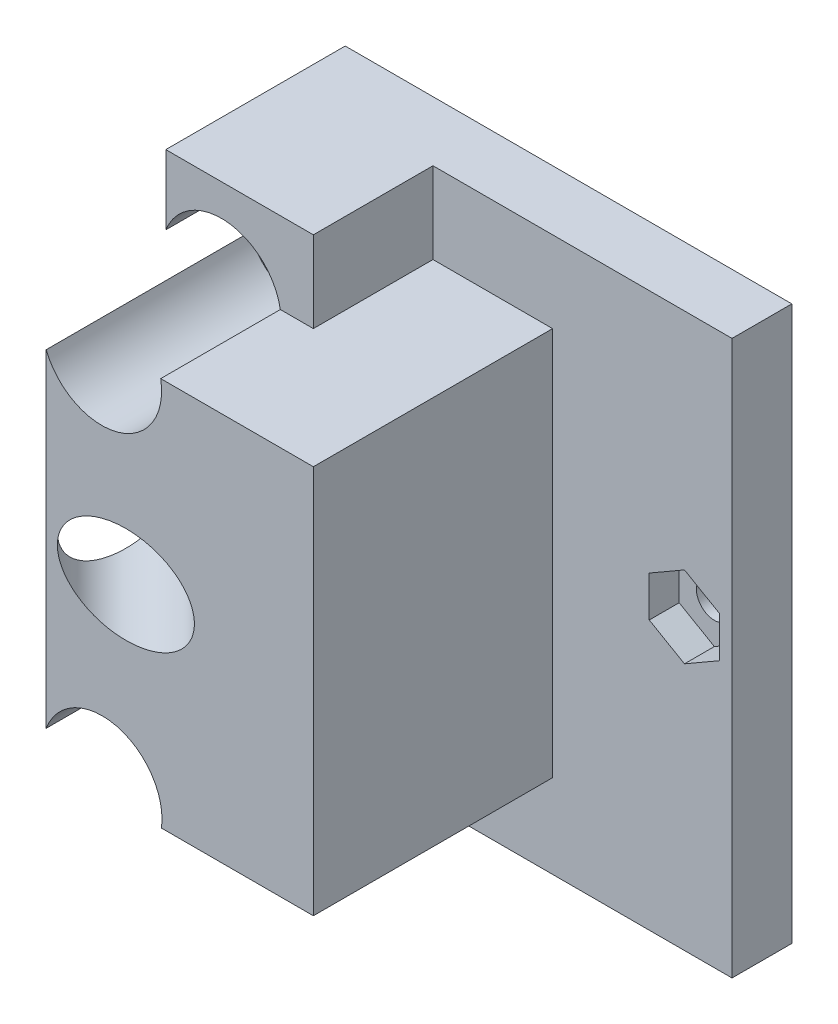
ISO-10303-21;
HEADER;
FILE_DESCRIPTION(('STEP AP214'),'2;1');
FILE_NAME('part.step','',(''),(''),'','','');
FILE_SCHEMA(('AUTOMOTIVE_DESIGN { 1 0 10303 214 1 1 1 1 }'));
ENDSEC;
DATA;
#1=APPLICATION_CONTEXT('core data for automotive mechanical design processes');
#2=APPLICATION_PROTOCOL_DEFINITION('international standard','automotive_design',2000,#1);
#3=PRODUCT_CONTEXT('',#1,'mechanical');
#4=PRODUCT('Part','Part','',(#3));
#5=PRODUCT_RELATED_PRODUCT_CATEGORY('part','',(#4));
#6=PRODUCT_DEFINITION_FORMATION('','',#4);
#7=PRODUCT_DEFINITION_CONTEXT('part definition',#1,'design');
#8=PRODUCT_DEFINITION('design','',#6,#7);
#9=PRODUCT_DEFINITION_SHAPE('','',#8);
#10=(LENGTH_UNIT() NAMED_UNIT(*) SI_UNIT(.MILLI.,.METRE.));
#11=(NAMED_UNIT(*) PLANE_ANGLE_UNIT() SI_UNIT($,.RADIAN.));
#12=(NAMED_UNIT(*) SI_UNIT($,.STERADIAN.) SOLID_ANGLE_UNIT());
#13=UNCERTAINTY_MEASURE_WITH_UNIT(LENGTH_MEASURE(1.E-05),#10,'distance_accuracy_value','');
#14=(GEOMETRIC_REPRESENTATION_CONTEXT(3) GLOBAL_UNCERTAINTY_ASSIGNED_CONTEXT((#13)) GLOBAL_UNIT_ASSIGNED_CONTEXT((#10,
#11,#12)) REPRESENTATION_CONTEXT('',''));
#15=CARTESIAN_POINT('',(0.,0.,0.));
#16=DIRECTION('',(0.,0.,1.));
#17=DIRECTION('',(1.,0.,0.));
#18=AXIS2_PLACEMENT_3D('',#15,#16,#17);
#19=CARTESIAN_POINT('',(30.675,21.15,15.));
#20=DIRECTION('',(-1.,0.,0.));
#21=DIRECTION('',(0.,-1.,0.));
#22=AXIS2_PLACEMENT_3D('',#19,#20,#21);
#23=PLANE('',#22);
#24=DIRECTION('',(0.,0.,-1.));
#25=VECTOR('',#24,1.);
#26=CARTESIAN_POINT('',(30.675,-16.155842551155,25.));
#27=LINE('',#26,#25);
#28=CARTESIAN_POINT('',(30.675,-16.155842551155,15.));
#29=VERTEX_POINT('',#28);
#30=CARTESIAN_POINT('',(30.675,-16.155842551155,5.));
#31=VERTEX_POINT('',#30);
#32=EDGE_CURVE('E226',#29,#31,#27,.T.);
#33=ORIENTED_EDGE('',*,*,#32,.F.);
#34=DIRECTION('',(0.,1.,0.));
#35=VECTOR('',#34,1.);
#36=CARTESIAN_POINT('',(30.675,21.15,15.));
#37=LINE('',#36,#35);
#38=CARTESIAN_POINT('',(30.67125,-21.15,15.));
#39=VERTEX_POINT('',#38);
#40=EDGE_CURVE('E423',#39,#29,#37,.T.);
#41=ORIENTED_EDGE('',*,*,#40,.F.);
#42=CARTESIAN_POINT('',(30.675,-21.15,15.));
#43=DIRECTION('',(0.,0.,-1.));
#44=VECTOR('',#43,1.);
#45=LINE('',#42,#44);
#46=CARTESIAN_POINT('',(30.67125,-21.15,5.));
#47=VERTEX_POINT('',#46);
#48=EDGE_CURVE('E431',#39,#47,#45,.T.);
#49=ORIENTED_EDGE('',*,*,#48,.T.);
#50=DIRECTION('',(0.,-1.,0.));
#51=VECTOR('',#50,1.);
#52=CARTESIAN_POINT('',(30.675,23.15,5.));
#53=LINE('',#52,#51);
#54=EDGE_CURVE('E39',#31,#47,#53,.T.);
#55=ORIENTED_EDGE('',*,*,#54,.F.);
#56=EDGE_LOOP('',(#33,#41,#49,#55));
#57=FACE_BOUND('',#56,.T.);
#58=ADVANCED_FACE('F35',(#57),#23,.F.);
#59=DIRECTION('',(0.,0.,1.));
#60=VECTOR('',#59,1.);
#61=CARTESIAN_POINT('',(30.675,16.3577374600954,25.));
#62=LINE('',#61,#60);
#63=CARTESIAN_POINT('',(30.675,16.3577374600954,5.));
#64=VERTEX_POINT('',#63);
#65=CARTESIAN_POINT('',(30.675,16.3577374600954,15.));
#66=VERTEX_POINT('',#65);
#67=EDGE_CURVE('E224',#64,#66,#62,.T.);
#68=ORIENTED_EDGE('',*,*,#67,.F.);
#69=CARTESIAN_POINT('',(30.675,23.15,5.));
#70=VERTEX_POINT('',#69);
#71=EDGE_CURVE('E308',#70,#64,#53,.T.);
#72=ORIENTED_EDGE('',*,*,#71,.F.);
#73=DIRECTION('',(0.,0.,-1.));
#74=VECTOR('',#73,1.);
#75=CARTESIAN_POINT('',(30.675,23.15,15.));
#76=LINE('',#75,#74);
#77=CARTESIAN_POINT('',(30.675,23.15,15.));
#78=VERTEX_POINT('',#77);
#79=EDGE_CURVE('E463',#78,#70,#76,.T.);
#80=ORIENTED_EDGE('',*,*,#79,.F.);
#81=EDGE_CURVE('E436',#66,#78,#37,.T.);
#82=ORIENTED_EDGE('',*,*,#81,.F.);
#83=EDGE_LOOP('',(#68,#72,#80,#82));
#84=FACE_BOUND('',#83,.T.);
#85=ADVANCED_FACE('F345',(#84),#23,.F.);
#86=CARTESIAN_POINT('',(55.675,23.15,5.));
#87=DIRECTION('',(0.,0.,-1.));
#88=DIRECTION('',(0.,1.,0.));
#89=AXIS2_PLACEMENT_3D('',#86,#87,#88);
#90=PLANE('',#89);
#91=DIRECTION('',(0.866025403784439,0.499999999999999,0.));
#92=VECTOR('',#91,1.);
#93=CARTESIAN_POINT('',(51.7,-2.40000000000001,5.));
#94=LINE('',#93,#92);
#95=CARTESIAN_POINT('',(51.7,-2.40000000000002,5.));
#96=VERTEX_POINT('',#95);
#97=CARTESIAN_POINT('',(54.6444863728671,-0.70000000000001,5.));
#98=VERTEX_POINT('',#97);
#99=EDGE_CURVE('E256',#96,#98,#94,.T.);
#100=ORIENTED_EDGE('',*,*,#99,.F.);
#101=DIRECTION('',(0.866025403784438,-0.500000000000001,0.));
#102=VECTOR('',#101,1.);
#103=CARTESIAN_POINT('',(48.7555136271329,-0.700000000000011,5.));
#104=LINE('',#103,#102);
#105=CARTESIAN_POINT('',(48.7555136271329,-0.700000000000011,5.));
#106=VERTEX_POINT('',#105);
#107=EDGE_CURVE('E61',#106,#96,#104,.T.);
#108=ORIENTED_EDGE('',*,*,#107,.F.);
#109=DIRECTION('',(0.,-1.,0.));
#110=VECTOR('',#109,1.);
#111=CARTESIAN_POINT('',(48.7555136271329,2.7,5.));
#112=LINE('',#111,#110);
#113=CARTESIAN_POINT('',(48.7555136271329,2.7,5.));
#114=VERTEX_POINT('',#113);
#115=EDGE_CURVE('E239',#114,#106,#112,.T.);
#116=ORIENTED_EDGE('',*,*,#115,.F.);
#117=DIRECTION('',(-0.866025403784439,-0.5,0.));
#118=VECTOR('',#117,1.);
#119=CARTESIAN_POINT('',(51.7,4.39999999999999,5.));
#120=LINE('',#119,#118);
#121=CARTESIAN_POINT('',(51.7,4.39999999999999,5.));
#122=VERTEX_POINT('',#121);
#123=EDGE_CURVE('E265',#122,#114,#120,.T.);
#124=ORIENTED_EDGE('',*,*,#123,.F.);
#125=DIRECTION('',(-0.866025403784439,0.5,0.));
#126=VECTOR('',#125,1.);
#127=CARTESIAN_POINT('',(54.6444863728671,2.69999999999999,5.));
#128=LINE('',#127,#126);
#129=CARTESIAN_POINT('',(54.6444863728671,2.69999999999999,5.));
#130=VERTEX_POINT('',#129);
#131=EDGE_CURVE('E262',#130,#122,#128,.T.);
#132=ORIENTED_EDGE('',*,*,#131,.F.);
#133=DIRECTION('',(0.,1.,0.));
#134=VECTOR('',#133,1.);
#135=CARTESIAN_POINT('',(54.6444863728671,-0.70000000000001,5.));
#136=LINE('',#135,#134);
#137=EDGE_CURVE('E259',#98,#130,#136,.T.);
#138=ORIENTED_EDGE('',*,*,#137,.F.);
#139=EDGE_LOOP('',(#100,#108,#116,#124,#132,#138));
#140=FACE_BOUND('',#139,.T.);
#141=DIRECTION('',(-1.,0.,0.));
#142=VECTOR('',#141,1.);
#143=CARTESIAN_POINT('',(40.675,-16.155842551155,5.));
#144=LINE('',#143,#142);
#145=CARTESIAN_POINT('',(40.675,-16.155842551155,4.99999999999999));
#146=VERTEX_POINT('',#145);
#147=EDGE_CURVE('E53',#146,#31,#144,.T.);
#148=ORIENTED_EDGE('',*,*,#147,.T.);
#149=ORIENTED_EDGE('',*,*,#54,.T.);
#150=CARTESIAN_POINT('',(30.675,-23.1592483433118,4.99999999999999));
#151=VERTEX_POINT('',#150);
#152=EDGE_CURVE('E304',#47,#151,#53,.T.);
#153=ORIENTED_EDGE('',*,*,#152,.T.);
#154=DIRECTION('',(-1.,0.,0.));
#155=VECTOR('',#154,1.);
#156=CARTESIAN_POINT('',(55.675,-23.1592483433118,4.99999999999999));
#157=LINE('',#156,#155);
#158=CARTESIAN_POINT('',(55.675,-23.1592483433118,4.99999999999999));
#159=VERTEX_POINT('',#158);
#160=EDGE_CURVE('E529',#159,#151,#157,.T.);
#161=ORIENTED_EDGE('',*,*,#160,.F.);
#162=DIRECTION('',(0.,-1.,0.));
#163=VECTOR('',#162,1.);
#164=CARTESIAN_POINT('',(55.675,23.15,5.));
#165=LINE('',#164,#163);
#166=CARTESIAN_POINT('',(55.675,23.15,5.));
#167=VERTEX_POINT('',#166);
#168=EDGE_CURVE('E292',#167,#159,#165,.T.);
#169=ORIENTED_EDGE('',*,*,#168,.F.);
#170=DIRECTION('',(-1.,0.,0.));
#171=VECTOR('',#170,1.);
#172=CARTESIAN_POINT('',(55.675,23.15,5.));
#173=LINE('',#172,#171);
#174=EDGE_CURVE('E305',#167,#70,#173,.T.);
#175=ORIENTED_EDGE('',*,*,#174,.T.);
#176=ORIENTED_EDGE('',*,*,#71,.T.);
#177=DIRECTION('',(-1.,0.,0.));
#178=VECTOR('',#177,1.);
#179=CARTESIAN_POINT('',(40.675,16.3577374600954,5.));
#180=LINE('',#179,#178);
#181=CARTESIAN_POINT('',(40.675,16.3577374600954,5.));
#182=VERTEX_POINT('',#181);
#183=EDGE_CURVE('E231',#182,#64,#180,.T.);
#184=ORIENTED_EDGE('',*,*,#183,.F.);
#185=DIRECTION('',(0.,1.,0.));
#186=VECTOR('',#185,1.);
#187=CARTESIAN_POINT('',(40.675,16.3577374600954,5.));
#188=LINE('',#187,#186);
#189=EDGE_CURVE('E218',#146,#182,#188,.T.);
#190=ORIENTED_EDGE('',*,*,#189,.F.);
#191=EDGE_LOOP('',(#148,#149,#153,#161,#169,#175,#176,#184,#190));
#192=FACE_BOUND('',#191,.T.);
#193=ADVANCED_FACE('F341',(#140,#192),#90,.F.);
#194=CARTESIAN_POINT('',(51.7,0.999999999999993,-20.));
#195=DIRECTION('',(0.,0.,1.));
#196=DIRECTION('',(1.,0.,0.));
#197=AXIS2_PLACEMENT_3D('',#194,#195,#196);
#198=CYLINDRICAL_SURFACE('',#197,1.5);
#199=CARTESIAN_POINT('',(51.7,0.999999999999993,0.));
#200=DIRECTION('',(0.,0.,1.));
#201=DIRECTION('',(1.,0.,0.));
#202=AXIS2_PLACEMENT_3D('',#199,#200,#201);
#203=CIRCLE('',#202,1.5);
#204=CARTESIAN_POINT('',(53.2,0.999999999999993,0.));
#205=VERTEX_POINT('',#204);
#206=EDGE_CURVE('E282',#205,#205,#203,.T.);
#207=ORIENTED_EDGE('',*,*,#206,.F.);
#208=EDGE_LOOP('',(#207));
#209=FACE_BOUND('',#208,.T.);
#210=CARTESIAN_POINT('',(51.7,0.999999999999993,2.5));
#211=DIRECTION('',(0.,0.,1.));
#212=DIRECTION('',(1.,0.,0.));
#213=AXIS2_PLACEMENT_3D('',#210,#211,#212);
#214=CIRCLE('',#213,1.5);
#215=CARTESIAN_POINT('',(53.2,0.999999999999993,2.5));
#216=VERTEX_POINT('',#215);
#217=EDGE_CURVE('E272',#216,#216,#214,.F.);
#218=ORIENTED_EDGE('',*,*,#217,.F.);
#219=EDGE_LOOP('',(#218));
#220=FACE_BOUND('',#219,.T.);
#221=ADVANCED_FACE('F344',(#209,#220),#198,.F.);
#222=CARTESIAN_POINT('',(23.0217282457291,-15.5,50.));
#223=DIRECTION('',(0.,0.,-1.));
#224=DIRECTION('',(-1.,0.,0.));
#225=AXIS2_PLACEMENT_3D('',#222,#223,#224);
#226=CYLINDRICAL_SURFACE('',#225,1.6);
#227=CARTESIAN_POINT('',(23.0217282457291,-15.5,0.));
#228=DIRECTION('',(0.,0.,-1.));
#229=DIRECTION('',(-1.,0.,0.));
#230=AXIS2_PLACEMENT_3D('',#227,#228,#229);
#231=CIRCLE('',#230,1.6);
#232=CARTESIAN_POINT('',(21.4217282457291,-15.5,0.));
#233=VERTEX_POINT('',#232);
#234=EDGE_CURVE('E481',#233,#233,#231,.T.);
#235=ORIENTED_EDGE('',*,*,#234,.T.);
#236=EDGE_LOOP('',(#235));
#237=FACE_BOUND('',#236,.T.);
#238=CARTESIAN_POINT('',(23.0217282457291,-15.5,7.99999999999999));
#239=DIRECTION('',(0.,0.,1.));
#240=DIRECTION('',(1.,0.,0.));
#241=AXIS2_PLACEMENT_3D('',#238,#239,#240);
#242=CIRCLE('',#241,1.6);
#243=CARTESIAN_POINT('',(24.6217282457291,-15.5,7.99999999999999));
#244=VERTEX_POINT('',#243);
#245=EDGE_CURVE('E492',#244,#244,#242,.F.);
#246=ORIENTED_EDGE('',*,*,#245,.F.);
#247=EDGE_LOOP('',(#246));
#248=FACE_BOUND('',#247,.T.);
#249=ADVANCED_FACE('F370',(#237,#248),#226,.F.);
#250=CARTESIAN_POINT('',(22.9875,15.5,50.));
#251=DIRECTION('',(0.,0.,-1.));
#252=DIRECTION('',(-1.,0.,0.));
#253=AXIS2_PLACEMENT_3D('',#250,#251,#252);
#254=CYLINDRICAL_SURFACE('',#253,1.6);
#255=CARTESIAN_POINT('',(22.9875,15.5,0.));
#256=DIRECTION('',(0.,0.,-1.));
#257=DIRECTION('',(-1.,0.,0.));
#258=AXIS2_PLACEMENT_3D('',#255,#256,#257);
#259=CIRCLE('',#258,1.6);
#260=CARTESIAN_POINT('',(21.3875,15.5,0.));
#261=VERTEX_POINT('',#260);
#262=EDGE_CURVE('E479',#261,#261,#259,.T.);
#263=ORIENTED_EDGE('',*,*,#262,.T.);
#264=EDGE_LOOP('',(#263));
#265=FACE_BOUND('',#264,.T.);
#266=CARTESIAN_POINT('',(22.9875,15.5,7.99999999999999));
#267=DIRECTION('',(0.,0.,1.));
#268=DIRECTION('',(1.,0.,0.));
#269=AXIS2_PLACEMENT_3D('',#266,#267,#268);
#270=CIRCLE('',#269,1.6);
#271=CARTESIAN_POINT('',(24.5875,15.5,7.99999999999999));
#272=VERTEX_POINT('',#271);
#273=EDGE_CURVE('E444',#272,#272,#270,.F.);
#274=ORIENTED_EDGE('',*,*,#273,.F.);
#275=EDGE_LOOP('',(#274));
#276=FACE_BOUND('',#275,.T.);
#277=ADVANCED_FACE('F367',(#265,#276),#254,.F.);
#278=CARTESIAN_POINT('',(30.7,-16.155842551155,15.));
#279=DIRECTION('',(0.,1.,0.));
#280=DIRECTION('',(0.,0.,1.));
#281=AXIS2_PLACEMENT_3D('',#278,#279,#280);
#282=PLANE('',#281);
#283=DIRECTION('',(-1.,0.,0.));
#284=VECTOR('',#283,1.);
#285=CARTESIAN_POINT('',(30.7,-16.155842551155,25.));
#286=LINE('',#285,#284);
#287=CARTESIAN_POINT('',(40.675,-16.155842551155,25.));
#288=VERTEX_POINT('',#287);
#289=CARTESIAN_POINT('',(27.9785286802932,-16.155842551155,25.));
#290=VERTEX_POINT('',#289);
#291=EDGE_CURVE('E202',#288,#290,#286,.T.);
#292=ORIENTED_EDGE('',*,*,#291,.T.);
#293=DIRECTION('',(0.,0.,1.));
#294=VECTOR('',#293,1.);
#295=CARTESIAN_POINT('',(27.9785286802932,-16.155842551155,7.99999999999999));
#296=LINE('',#295,#294);
#297=CARTESIAN_POINT('',(27.9785286802932,-16.155842551155,15.));
#298=VERTEX_POINT('',#297);
#299=EDGE_CURVE('E427',#290,#298,#296,.F.);
#300=ORIENTED_EDGE('',*,*,#299,.T.);
#301=DIRECTION('',(-1.,0.,0.));
#302=VECTOR('',#301,1.);
#303=CARTESIAN_POINT('',(30.7,-16.155842551155,15.));
#304=LINE('',#303,#302);
#305=EDGE_CURVE('E426',#29,#298,#304,.T.);
#306=ORIENTED_EDGE('',*,*,#305,.F.);
#307=ORIENTED_EDGE('',*,*,#32,.T.);
#308=ORIENTED_EDGE('',*,*,#147,.F.);
#309=DIRECTION('',(0.,0.,-1.));
#310=VECTOR('',#309,1.);
#311=CARTESIAN_POINT('',(40.675,-16.155842551155,25.));
#312=LINE('',#311,#310);
#313=EDGE_CURVE('E214',#288,#146,#312,.T.);
#314=ORIENTED_EDGE('',*,*,#313,.F.);
#315=EDGE_LOOP('',(#292,#300,#306,#307,#308,#314));
#316=FACE_BOUND('',#315,.T.);
#317=ADVANCED_FACE('F215',(#316),#282,.F.);
#318=CARTESIAN_POINT('',(30.7,16.3577374600954,25.));
#319=DIRECTION('',(0.,0.,-1.));
#320=DIRECTION('',(-1.,0.,0.));
#321=AXIS2_PLACEMENT_3D('',#318,#319,#320);
#322=PLANE('',#321);
#323=CARTESIAN_POINT('',(25.0000000000006,0.,25.));
#324=DIRECTION('',(0.,0.,-1.));
#325=DIRECTION('',(1.,0.,0.));
#326=AXIS2_PLACEMENT_3D('',#323,#324,#325);
#327=ELLIPSE('',#326,5.72756492761111,4.05);
#328=CARTESIAN_POINT('',(30.7275649276117,0.,25.));
#329=VERTEX_POINT('',#328);
#330=EDGE_CURVE('E450',#329,#329,#327,.T.);
#331=ORIENTED_EDGE('',*,*,#330,.T.);
#332=EDGE_LOOP('',(#331));
#333=FACE_BOUND('',#332,.T.);
#334=DIRECTION('',(-1.,0.,0.));
#335=VECTOR('',#334,1.);
#336=CARTESIAN_POINT('',(30.7,16.3577374600954,25.));
#337=LINE('',#336,#335);
#338=CARTESIAN_POINT('',(40.675,16.3577374600954,25.));
#339=VERTEX_POINT('',#338);
#340=CARTESIAN_POINT('',(27.9133792564931,16.3577374600954,25.));
#341=VERTEX_POINT('',#340);
#342=EDGE_CURVE('E211',#339,#341,#337,.T.);
#343=ORIENTED_EDGE('',*,*,#342,.T.);
#344=CARTESIAN_POINT('',(22.9875,15.5,25.));
#345=DIRECTION('',(0.,0.,1.));
#346=DIRECTION('',(1.,0.,0.));
#347=AXIS2_PLACEMENT_3D('',#344,#345,#346);
#348=CIRCLE('',#347,5.);
#349=CARTESIAN_POINT('',(18.3375,13.6622024050511,25.));
#350=VERTEX_POINT('',#349);
#351=EDGE_CURVE('E493',#350,#341,#348,.T.);
#352=ORIENTED_EDGE('',*,*,#351,.F.);
#353=DIRECTION('',(0.,-1.,0.));
#354=VECTOR('',#353,1.);
#355=CARTESIAN_POINT('',(18.3375,23.15,25.));
#356=LINE('',#355,#354);
#357=CARTESIAN_POINT('',(18.3375,-13.7512845451837,25.));
#358=VERTEX_POINT('',#357);
#359=EDGE_CURVE('E321',#350,#358,#356,.T.);
#360=ORIENTED_EDGE('',*,*,#359,.T.);
#361=CARTESIAN_POINT('',(23.0217282457291,-15.5,25.));
#362=DIRECTION('',(0.,0.,1.));
#363=DIRECTION('',(1.,0.,0.));
#364=AXIS2_PLACEMENT_3D('',#361,#362,#363);
#365=CIRCLE('',#364,5.);
#366=EDGE_CURVE('E208',#290,#358,#365,.T.);
#367=ORIENTED_EDGE('',*,*,#366,.F.);
#368=ORIENTED_EDGE('',*,*,#291,.F.);
#369=DIRECTION('',(0.,-1.,0.));
#370=VECTOR('',#369,1.);
#371=CARTESIAN_POINT('',(40.675,16.3577374600954,25.));
#372=LINE('',#371,#370);
#373=EDGE_CURVE('E205',#339,#288,#372,.T.);
#374=ORIENTED_EDGE('',*,*,#373,.F.);
#375=EDGE_LOOP('',(#343,#352,#360,#367,#368,#374));
#376=FACE_BOUND('',#375,.T.);
#377=ADVANCED_FACE('F203',(#333,#376),#322,.F.);
#378=CARTESIAN_POINT('',(0.,0.,15.));
#379=DIRECTION('',(0.,0.,1.));
#380=DIRECTION('',(1.,0.,0.));
#381=AXIS2_PLACEMENT_3D('',#378,#379,#380);
#382=PLANE('',#381);
#383=DIRECTION('',(0.,1.,0.));
#384=VECTOR('',#383,1.);
#385=CARTESIAN_POINT('',(18.3375,0.,15.));
#386=LINE('',#385,#384);
#387=CARTESIAN_POINT('',(18.3375,-23.15,15.));
#388=VERTEX_POINT('',#387);
#389=CARTESIAN_POINT('',(18.3375,-17.2487154548163,15.));
#390=VERTEX_POINT('',#389);
#391=EDGE_CURVE('E516',#388,#390,#386,.T.);
#392=ORIENTED_EDGE('',*,*,#391,.F.);
#393=DIRECTION('',(1.,0.,0.));
#394=VECTOR('',#393,1.);
#395=CARTESIAN_POINT('',(15.3375,-23.15,15.));
#396=LINE('',#395,#394);
#397=CARTESIAN_POINT('',(30.6675,-23.15,15.));
#398=VERTEX_POINT('',#397);
#399=EDGE_CURVE('E455',#388,#398,#396,.T.);
#400=ORIENTED_EDGE('',*,*,#399,.T.);
#401=DIRECTION('',(0.,1.,0.));
#402=VECTOR('',#401,1.);
#403=CARTESIAN_POINT('',(30.6675,-21.15,15.));
#404=LINE('',#403,#402);
#405=EDGE_CURVE('E392',#398,#39,#404,.T.);
#406=ORIENTED_EDGE('',*,*,#405,.T.);
#407=ORIENTED_EDGE('',*,*,#40,.T.);
#408=ORIENTED_EDGE('',*,*,#305,.T.);
#409=CARTESIAN_POINT('',(23.0217282457291,-15.5,15.));
#410=DIRECTION('',(0.,0.,1.));
#411=DIRECTION('',(1.,0.,0.));
#412=AXIS2_PLACEMENT_3D('',#409,#410,#411);
#413=CIRCLE('',#412,5.);
#414=EDGE_CURVE('E490',#390,#298,#413,.T.);
#415=ORIENTED_EDGE('',*,*,#414,.F.);
#416=EDGE_LOOP('',(#392,#400,#406,#407,#408,#415));
#417=FACE_BOUND('',#416,.T.);
#418=ADVANCED_FACE('F434',(#417),#382,.T.);
#419=DIRECTION('',(0.,1.,0.));
#420=VECTOR('',#419,1.);
#421=CARTESIAN_POINT('',(18.3375,0.,15.));
#422=LINE('',#421,#420);
#423=CARTESIAN_POINT('',(18.3375,17.3377975949489,15.));
#424=VERTEX_POINT('',#423);
#425=CARTESIAN_POINT('',(18.3375,23.15,15.));
#426=VERTEX_POINT('',#425);
#427=EDGE_CURVE('E506',#424,#426,#422,.T.);
#428=ORIENTED_EDGE('',*,*,#427,.F.);
#429=CARTESIAN_POINT('',(22.9875,15.5,15.));
#430=DIRECTION('',(0.,0.,1.));
#431=DIRECTION('',(1.,0.,0.));
#432=AXIS2_PLACEMENT_3D('',#429,#430,#431);
#433=CIRCLE('',#432,5.);
#434=CARTESIAN_POINT('',(27.9133792564931,16.3577374600954,15.));
#435=VERTEX_POINT('',#434);
#436=EDGE_CURVE('E484',#435,#424,#433,.T.);
#437=ORIENTED_EDGE('',*,*,#436,.F.);
#438=DIRECTION('',(-1.,0.,0.));
#439=VECTOR('',#438,1.);
#440=CARTESIAN_POINT('',(30.7,16.3577374600954,15.));
#441=LINE('',#440,#439);
#442=EDGE_CURVE('E430',#66,#435,#441,.T.);
#443=ORIENTED_EDGE('',*,*,#442,.F.);
#444=ORIENTED_EDGE('',*,*,#81,.T.);
#445=DIRECTION('',(-1.,0.,0.));
#446=VECTOR('',#445,1.);
#447=CARTESIAN_POINT('',(30.675,23.15,15.));
#448=LINE('',#447,#446);
#449=EDGE_CURVE('E469',#78,#426,#448,.T.);
#450=ORIENTED_EDGE('',*,*,#449,.T.);
#451=EDGE_LOOP('',(#428,#437,#443,#444,#450));
#452=FACE_BOUND('',#451,.T.);
#453=ADVANCED_FACE('F569',(#452),#382,.T.);
#454=CARTESIAN_POINT('',(0.,0.,0.));
#455=DIRECTION('',(0.,0.,1.));
#456=DIRECTION('',(1.,0.,0.));
#457=AXIS2_PLACEMENT_3D('',#454,#455,#456);
#458=PLANE('',#457);
#459=ORIENTED_EDGE('',*,*,#206,.T.);
#460=EDGE_LOOP('',(#459));
#461=FACE_BOUND('',#460,.T.);
#462=ORIENTED_EDGE('',*,*,#262,.F.);
#463=EDGE_LOOP('',(#462));
#464=FACE_BOUND('',#463,.T.);
#465=ORIENTED_EDGE('',*,*,#234,.F.);
#466=EDGE_LOOP('',(#465));
#467=FACE_BOUND('',#466,.T.);
#468=DIRECTION('',(1.,0.,0.));
#469=VECTOR('',#468,1.);
#470=CARTESIAN_POINT('',(15.3375,-23.15,0.));
#471=LINE('',#470,#469);
#472=CARTESIAN_POINT('',(18.3375,-23.15,0.));
#473=VERTEX_POINT('',#472);
#474=CARTESIAN_POINT('',(30.6675,-23.15,0.));
#475=VERTEX_POINT('',#474);
#476=EDGE_CURVE('E459',#473,#475,#471,.T.);
#477=ORIENTED_EDGE('',*,*,#476,.F.);
#478=DIRECTION('',(0.,-1.,0.));
#479=VECTOR('',#478,1.);
#480=CARTESIAN_POINT('',(18.3375,23.15,0.));
#481=LINE('',#480,#479);
#482=CARTESIAN_POINT('',(18.3375,23.15,0.));
#483=VERTEX_POINT('',#482);
#484=EDGE_CURVE('E527',#483,#473,#481,.T.);
#485=ORIENTED_EDGE('',*,*,#484,.F.);
#486=DIRECTION('',(-1.,0.,0.));
#487=VECTOR('',#486,1.);
#488=CARTESIAN_POINT('',(30.675,23.15,0.));
#489=LINE('',#488,#487);
#490=CARTESIAN_POINT('',(55.675,23.15,0.));
#491=VERTEX_POINT('',#490);
#492=EDGE_CURVE('E474',#491,#483,#489,.T.);
#493=ORIENTED_EDGE('',*,*,#492,.F.);
#494=DIRECTION('',(0.,1.,0.));
#495=VECTOR('',#494,1.);
#496=CARTESIAN_POINT('',(55.675,23.15,0.));
#497=LINE('',#496,#495);
#498=CARTESIAN_POINT('',(55.675,-23.1592483433118,0.));
#499=VERTEX_POINT('',#498);
#500=EDGE_CURVE('E286',#499,#491,#497,.T.);
#501=ORIENTED_EDGE('',*,*,#500,.F.);
#502=DIRECTION('',(-1.,0.,0.));
#503=VECTOR('',#502,1.);
#504=CARTESIAN_POINT('',(55.675,-23.1592483433118,0.));
#505=LINE('',#504,#503);
#506=CARTESIAN_POINT('',(30.675,-23.1592483433118,0.));
#507=VERTEX_POINT('',#506);
#508=EDGE_CURVE('E296',#499,#507,#505,.T.);
#509=ORIENTED_EDGE('',*,*,#508,.T.);
#510=DIRECTION('',(0.,1.,0.));
#511=VECTOR('',#510,1.);
#512=CARTESIAN_POINT('',(30.675,23.15,0.));
#513=LINE('',#512,#511);
#514=CARTESIAN_POINT('',(30.673125,-21.15,0.));
#515=VERTEX_POINT('',#514);
#516=EDGE_CURVE('E285',#507,#515,#513,.T.);
#517=ORIENTED_EDGE('',*,*,#516,.T.);
#518=DIRECTION('',(0.,1.,0.));
#519=VECTOR('',#518,1.);
#520=CARTESIAN_POINT('',(30.6675,-21.15,0.));
#521=LINE('',#520,#519);
#522=EDGE_CURVE('E456',#475,#515,#521,.T.);
#523=ORIENTED_EDGE('',*,*,#522,.F.);
#524=EDGE_LOOP('',(#477,#485,#493,#501,#509,#517,#523));
#525=FACE_BOUND('',#524,.T.);
#526=ADVANCED_FACE('F542',(#461,#464,#467,#525),#458,.F.);
#527=CARTESIAN_POINT('',(30.7,16.3577374600954,15.));
#528=DIRECTION('',(0.,-1.,0.));
#529=DIRECTION('',(0.,0.,-1.));
#530=AXIS2_PLACEMENT_3D('',#527,#528,#529);
#531=PLANE('',#530);
#532=ORIENTED_EDGE('',*,*,#67,.T.);
#533=ORIENTED_EDGE('',*,*,#442,.T.);
#534=DIRECTION('',(0.,0.,1.));
#535=VECTOR('',#534,1.);
#536=CARTESIAN_POINT('',(27.9133792564931,16.3577374600954,7.99999999999999));
#537=LINE('',#536,#535);
#538=EDGE_CURVE('E45',#435,#341,#537,.T.);
#539=ORIENTED_EDGE('',*,*,#538,.T.);
#540=ORIENTED_EDGE('',*,*,#342,.F.);
#541=DIRECTION('',(0.,0.,1.));
#542=VECTOR('',#541,1.);
#543=CARTESIAN_POINT('',(40.675,16.3577374600954,25.));
#544=LINE('',#543,#542);
#545=EDGE_CURVE('E223',#182,#339,#544,.T.);
#546=ORIENTED_EDGE('',*,*,#545,.F.);
#547=ORIENTED_EDGE('',*,*,#183,.T.);
#548=EDGE_LOOP('',(#532,#533,#539,#540,#546,#547));
#549=FACE_BOUND('',#548,.T.);
#550=ADVANCED_FACE('F547',(#549),#531,.F.);
#551=CARTESIAN_POINT('',(15.7664321881348,0.,15.7664321881344));
#552=DIRECTION('',(0.707106781186556,0.,0.707106781186539));
#553=DIRECTION('',(0.707106781186539,0.,-0.707106781186556));
#554=AXIS2_PLACEMENT_3D('',#551,#552,#553);
#555=CYLINDRICAL_SURFACE('',#554,4.05);
#556=CARTESIAN_POINT('',(18.3375,0.,18.3374999999996));
#557=DIRECTION('',(1.,0.,0.));
#558=DIRECTION('',(0.,0.,1.));
#559=AXIS2_PLACEMENT_3D('',#556,#557,#558);
#560=ELLIPSE('',#559,5.72756492761097,4.05);
#561=CARTESIAN_POINT('',(18.3375,0.,24.0650649276105));
#562=VERTEX_POINT('',#561);
#563=EDGE_CURVE('E497',#562,#562,#560,.F.);
#564=ORIENTED_EDGE('',*,*,#563,.T.);
#565=EDGE_LOOP('',(#564));
#566=FACE_BOUND('',#565,.T.);
#567=ORIENTED_EDGE('',*,*,#330,.F.);
#568=EDGE_LOOP('',(#567));
#569=FACE_BOUND('',#568,.T.);
#570=ADVANCED_FACE('F582',(#566,#569),#555,.F.);
#571=CARTESIAN_POINT('',(15.3375,-23.15,15.));
#572=DIRECTION('',(0.,1.,0.));
#573=DIRECTION('',(-1.,0.,0.));
#574=AXIS2_PLACEMENT_3D('',#571,#572,#573);
#575=PLANE('',#574);
#576=ORIENTED_EDGE('',*,*,#399,.F.);
#577=DIRECTION('',(0.,0.,-1.));
#578=VECTOR('',#577,1.);
#579=CARTESIAN_POINT('',(18.3375,-23.15,25.));
#580=LINE('',#579,#578);
#581=EDGE_CURVE('E524',#388,#473,#580,.T.);
#582=ORIENTED_EDGE('',*,*,#581,.T.);
#583=ORIENTED_EDGE('',*,*,#476,.T.);
#584=DIRECTION('',(0.,0.,-1.));
#585=VECTOR('',#584,1.);
#586=CARTESIAN_POINT('',(30.6675,-23.15,15.));
#587=LINE('',#586,#585);
#588=EDGE_CURVE('E212',#398,#475,#587,.T.);
#589=ORIENTED_EDGE('',*,*,#588,.F.);
#590=EDGE_LOOP('',(#576,#582,#583,#589));
#591=FACE_BOUND('',#590,.T.);
#592=ADVANCED_FACE('F382',(#591),#575,.F.);
#593=CARTESIAN_POINT('',(30.6675,-21.15,15.));
#594=DIRECTION('',(-1.,0.,0.));
#595=DIRECTION('',(0.,0.,1.));
#596=AXIS2_PLACEMENT_3D('',#593,#594,#595);
#597=PLANE('',#596);
#598=ORIENTED_EDGE('',*,*,#522,.T.);
#599=CARTESIAN_POINT('',(30.675,-21.15,5.));
#600=DIRECTION('',(0.,0.,-1.));
#601=VECTOR('',#600,1.);
#602=LINE('',#599,#601);
#603=EDGE_CURVE('E316',#47,#515,#602,.T.);
#604=ORIENTED_EDGE('',*,*,#603,.F.);
#605=ORIENTED_EDGE('',*,*,#48,.F.);
#606=ORIENTED_EDGE('',*,*,#405,.F.);
#607=ORIENTED_EDGE('',*,*,#588,.T.);
#608=EDGE_LOOP('',(#598,#604,#605,#606,#607));
#609=FACE_BOUND('',#608,.T.);
#610=ADVANCED_FACE('F377',(#609),#597,.F.);
#611=CARTESIAN_POINT('',(30.675,23.15,15.));
#612=DIRECTION('',(0.,-1.,0.));
#613=DIRECTION('',(1.,0.,0.));
#614=AXIS2_PLACEMENT_3D('',#611,#612,#613);
#615=PLANE('',#614);
#616=ORIENTED_EDGE('',*,*,#492,.T.);
#617=DIRECTION('',(0.,0.,-1.));
#618=VECTOR('',#617,1.);
#619=CARTESIAN_POINT('',(18.3375,23.15,25.));
#620=LINE('',#619,#618);
#621=EDGE_CURVE('E525',#426,#483,#620,.T.);
#622=ORIENTED_EDGE('',*,*,#621,.F.);
#623=ORIENTED_EDGE('',*,*,#449,.F.);
#624=ORIENTED_EDGE('',*,*,#79,.T.);
#625=ORIENTED_EDGE('',*,*,#174,.F.);
#626=DIRECTION('',(0.,0.,1.));
#627=VECTOR('',#626,1.);
#628=CARTESIAN_POINT('',(55.675,23.15,0.));
#629=LINE('',#628,#627);
#630=EDGE_CURVE('E289',#491,#167,#629,.T.);
#631=ORIENTED_EDGE('',*,*,#630,.F.);
#632=EDGE_LOOP('',(#616,#622,#623,#624,#625,#631));
#633=FACE_BOUND('',#632,.T.);
#634=ADVANCED_FACE('F365',(#633),#615,.F.);
#635=CARTESIAN_POINT('',(22.9875,15.5,7.99999999999999));
#636=DIRECTION('',(0.,0.,1.));
#637=DIRECTION('',(1.,0.,0.));
#638=AXIS2_PLACEMENT_3D('',#635,#636,#637);
#639=CYLINDRICAL_SURFACE('',#638,5.);
#640=ORIENTED_EDGE('',*,*,#436,.T.);
#641=DIRECTION('',(0.,0.,1.));
#642=VECTOR('',#641,1.);
#643=CARTESIAN_POINT('',(18.3375,17.3377975949489,7.99999999999999));
#644=LINE('',#643,#642);
#645=CARTESIAN_POINT('',(18.3375,17.3377975949489,7.99999999999999));
#646=VERTEX_POINT('',#645);
#647=EDGE_CURVE('E508',#424,#646,#644,.F.);
#648=ORIENTED_EDGE('',*,*,#647,.T.);
#649=CARTESIAN_POINT('',(22.9875,15.5,7.99999999999999));
#650=DIRECTION('',(0.,0.,1.));
#651=DIRECTION('',(1.,0.,0.));
#652=AXIS2_PLACEMENT_3D('',#649,#650,#651);
#653=CIRCLE('',#652,5.);
#654=CARTESIAN_POINT('',(18.3375,13.6622024050511,7.99999999999999));
#655=VERTEX_POINT('',#654);
#656=EDGE_CURVE('E496',#655,#646,#653,.T.);
#657=ORIENTED_EDGE('',*,*,#656,.F.);
#658=DIRECTION('',(0.,0.,1.));
#659=VECTOR('',#658,1.);
#660=CARTESIAN_POINT('',(18.3375,13.6622024050511,7.99999999999999));
#661=LINE('',#660,#659);
#662=EDGE_CURVE('E511',#655,#350,#661,.T.);
#663=ORIENTED_EDGE('',*,*,#662,.T.);
#664=ORIENTED_EDGE('',*,*,#351,.T.);
#665=ORIENTED_EDGE('',*,*,#538,.F.);
#666=EDGE_LOOP('',(#640,#648,#657,#663,#664,#665));
#667=FACE_BOUND('',#666,.T.);
#668=ADVANCED_FACE('F361',(#667),#639,.F.);
#669=CARTESIAN_POINT('',(22.9875,15.5,7.99999999999999));
#670=DIRECTION('',(0.,0.,1.));
#671=DIRECTION('',(1.,0.,0.));
#672=AXIS2_PLACEMENT_3D('',#669,#670,#671);
#673=PLANE('',#672);
#674=DIRECTION('',(0.,1.,0.));
#675=VECTOR('',#674,1.);
#676=CARTESIAN_POINT('',(18.3375,15.5,7.99999999999999));
#677=LINE('',#676,#675);
#678=EDGE_CURVE('E514',#655,#646,#677,.T.);
#679=ORIENTED_EDGE('',*,*,#678,.F.);
#680=ORIENTED_EDGE('',*,*,#656,.T.);
#681=EDGE_LOOP('',(#679,#680));
#682=FACE_BOUND('',#681,.T.);
#683=ORIENTED_EDGE('',*,*,#273,.T.);
#684=EDGE_LOOP('',(#683));
#685=FACE_BOUND('',#684,.T.);
#686=ADVANCED_FACE('F357',(#682,#685),#673,.T.);
#687=CARTESIAN_POINT('',(23.0217282457291,-15.5,7.99999999999999));
#688=DIRECTION('',(0.,0.,1.));
#689=DIRECTION('',(1.,0.,0.));
#690=AXIS2_PLACEMENT_3D('',#687,#688,#689);
#691=CYLINDRICAL_SURFACE('',#690,5.);
#692=ORIENTED_EDGE('',*,*,#366,.T.);
#693=DIRECTION('',(0.,0.,1.));
#694=VECTOR('',#693,1.);
#695=CARTESIAN_POINT('',(18.3375,-13.7512845451837,7.99999999999999));
#696=LINE('',#695,#694);
#697=CARTESIAN_POINT('',(18.3375,-13.7512845451837,7.99999999999999));
#698=VERTEX_POINT('',#697);
#699=EDGE_CURVE('E518',#358,#698,#696,.F.);
#700=ORIENTED_EDGE('',*,*,#699,.T.);
#701=CARTESIAN_POINT('',(23.0217282457291,-15.5,7.99999999999999));
#702=DIRECTION('',(0.,0.,1.));
#703=DIRECTION('',(1.,0.,0.));
#704=AXIS2_PLACEMENT_3D('',#701,#702,#703);
#705=CIRCLE('',#704,5.);
#706=CARTESIAN_POINT('',(18.3375,-17.2487154548163,7.99999999999999));
#707=VERTEX_POINT('',#706);
#708=EDGE_CURVE('E501',#707,#698,#705,.T.);
#709=ORIENTED_EDGE('',*,*,#708,.F.);
#710=DIRECTION('',(0.,0.,1.));
#711=VECTOR('',#710,1.);
#712=CARTESIAN_POINT('',(18.3375,-17.2487154548163,7.99999999999999));
#713=LINE('',#712,#711);
#714=EDGE_CURVE('E521',#707,#390,#713,.T.);
#715=ORIENTED_EDGE('',*,*,#714,.T.);
#716=ORIENTED_EDGE('',*,*,#414,.T.);
#717=ORIENTED_EDGE('',*,*,#299,.F.);
#718=EDGE_LOOP('',(#692,#700,#709,#715,#716,#717));
#719=FACE_BOUND('',#718,.T.);
#720=ADVANCED_FACE('F353',(#719),#691,.F.);
#721=CARTESIAN_POINT('',(23.0217282457291,-15.5,7.99999999999999));
#722=DIRECTION('',(0.,0.,1.));
#723=DIRECTION('',(1.,0.,0.));
#724=AXIS2_PLACEMENT_3D('',#721,#722,#723);
#725=PLANE('',#724);
#726=DIRECTION('',(0.,1.,0.));
#727=VECTOR('',#726,1.);
#728=CARTESIAN_POINT('',(18.3375,-15.5,7.99999999999999));
#729=LINE('',#728,#727);
#730=EDGE_CURVE('E11',#707,#698,#729,.T.);
#731=ORIENTED_EDGE('',*,*,#730,.F.);
#732=ORIENTED_EDGE('',*,*,#708,.T.);
#733=EDGE_LOOP('',(#731,#732));
#734=FACE_BOUND('',#733,.T.);
#735=ORIENTED_EDGE('',*,*,#245,.T.);
#736=EDGE_LOOP('',(#735));
#737=FACE_BOUND('',#736,.T.);
#738=ADVANCED_FACE('F349',(#734,#737),#725,.T.);
#739=CARTESIAN_POINT('',(18.3375,23.15,25.));
#740=DIRECTION('',(1.,0.,0.));
#741=DIRECTION('',(0.,1.,0.));
#742=AXIS2_PLACEMENT_3D('',#739,#740,#741);
#743=PLANE('',#742);
#744=ORIENTED_EDGE('',*,*,#427,.T.);
#745=ORIENTED_EDGE('',*,*,#621,.T.);
#746=ORIENTED_EDGE('',*,*,#484,.T.);
#747=ORIENTED_EDGE('',*,*,#581,.F.);
#748=ORIENTED_EDGE('',*,*,#391,.T.);
#749=ORIENTED_EDGE('',*,*,#714,.F.);
#750=ORIENTED_EDGE('',*,*,#730,.T.);
#751=ORIENTED_EDGE('',*,*,#699,.F.);
#752=ORIENTED_EDGE('',*,*,#359,.F.);
#753=ORIENTED_EDGE('',*,*,#662,.F.);
#754=ORIENTED_EDGE('',*,*,#678,.T.);
#755=ORIENTED_EDGE('',*,*,#647,.F.);
#756=EDGE_LOOP('',(#744,#745,#746,#747,#748,#749,#750,#751,#752,#753,#754,#755));
#757=FACE_BOUND('',#756,.T.);
#758=ORIENTED_EDGE('',*,*,#563,.F.);
#759=EDGE_LOOP('',(#758));
#760=FACE_BOUND('',#759,.T.);
#761=ADVANCED_FACE('F339',(#757,#760),#743,.F.);
#762=CARTESIAN_POINT('',(55.675,-23.1592483433118,0.));
#763=DIRECTION('',(0.,1.,0.));
#764=DIRECTION('',(-1.,0.,0.));
#765=AXIS2_PLACEMENT_3D('',#762,#763,#764);
#766=PLANE('',#765);
#767=DIRECTION('',(0.,0.,-1.));
#768=VECTOR('',#767,1.);
#769=CARTESIAN_POINT('',(30.675,-23.1592483433118,0.));
#770=LINE('',#769,#768);
#771=EDGE_CURVE('E290',#151,#507,#770,.T.);
#772=ORIENTED_EDGE('',*,*,#771,.T.);
#773=ORIENTED_EDGE('',*,*,#508,.F.);
#774=DIRECTION('',(0.,0.,-1.));
#775=VECTOR('',#774,1.);
#776=CARTESIAN_POINT('',(55.675,-23.1592483433118,0.));
#777=LINE('',#776,#775);
#778=EDGE_CURVE('E294',#159,#499,#777,.T.);
#779=ORIENTED_EDGE('',*,*,#778,.F.);
#780=ORIENTED_EDGE('',*,*,#160,.T.);
#781=EDGE_LOOP('',(#772,#773,#779,#780));
#782=FACE_BOUND('',#781,.T.);
#783=ADVANCED_FACE('F336',(#782),#766,.F.);
#784=CARTESIAN_POINT('',(55.675,0.,0.));
#785=DIRECTION('',(-1.,0.,0.));
#786=DIRECTION('',(0.,-1.,0.));
#787=AXIS2_PLACEMENT_3D('',#784,#785,#786);
#788=PLANE('',#787);
#789=ORIENTED_EDGE('',*,*,#500,.T.);
#790=ORIENTED_EDGE('',*,*,#630,.T.);
#791=ORIENTED_EDGE('',*,*,#168,.T.);
#792=ORIENTED_EDGE('',*,*,#778,.T.);
#793=EDGE_LOOP('',(#789,#790,#791,#792));
#794=FACE_BOUND('',#793,.T.);
#795=ADVANCED_FACE('F334',(#794),#788,.F.);
#796=CARTESIAN_POINT('',(30.675,0.,0.));
#797=DIRECTION('',(-1.,0.,0.));
#798=DIRECTION('',(0.,-1.,0.));
#799=AXIS2_PLACEMENT_3D('',#796,#797,#798);
#800=PLANE('',#799);
#801=ORIENTED_EDGE('',*,*,#516,.F.);
#802=ORIENTED_EDGE('',*,*,#771,.F.);
#803=ORIENTED_EDGE('',*,*,#152,.F.);
#804=ORIENTED_EDGE('',*,*,#603,.T.);
#805=EDGE_LOOP('',(#801,#802,#803,#804));
#806=FACE_BOUND('',#805,.T.);
#807=ADVANCED_FACE('F323',(#806),#800,.T.);
#808=CARTESIAN_POINT('',(0.,0.,2.5));
#809=DIRECTION('',(0.,0.,1.));
#810=DIRECTION('',(1.,0.,0.));
#811=AXIS2_PLACEMENT_3D('',#808,#809,#810);
#812=PLANE('',#811);
#813=DIRECTION('',(0.866025403784438,-0.500000000000001,0.));
#814=VECTOR('',#813,1.);
#815=CARTESIAN_POINT('',(48.7555136271329,-0.700000000000011,2.5));
#816=LINE('',#815,#814);
#817=CARTESIAN_POINT('',(48.7555136271329,-0.700000000000011,2.5));
#818=VERTEX_POINT('',#817);
#819=CARTESIAN_POINT('',(51.7,-2.40000000000001,2.5));
#820=VERTEX_POINT('',#819);
#821=EDGE_CURVE('E235',#818,#820,#816,.T.);
#822=ORIENTED_EDGE('',*,*,#821,.T.);
#823=DIRECTION('',(0.866025403784439,0.499999999999999,0.));
#824=VECTOR('',#823,1.);
#825=CARTESIAN_POINT('',(51.7,-2.40000000000001,2.5));
#826=LINE('',#825,#824);
#827=CARTESIAN_POINT('',(54.6444863728671,-0.70000000000001,2.5));
#828=VERTEX_POINT('',#827);
#829=EDGE_CURVE('E238',#820,#828,#826,.T.);
#830=ORIENTED_EDGE('',*,*,#829,.T.);
#831=DIRECTION('',(0.,1.,0.));
#832=VECTOR('',#831,1.);
#833=CARTESIAN_POINT('',(54.6444863728671,-0.70000000000001,2.5));
#834=LINE('',#833,#832);
#835=CARTESIAN_POINT('',(54.6444863728671,2.69999999999999,2.5));
#836=VERTEX_POINT('',#835);
#837=EDGE_CURVE('E242',#828,#836,#834,.T.);
#838=ORIENTED_EDGE('',*,*,#837,.T.);
#839=DIRECTION('',(-0.866025403784439,0.5,0.));
#840=VECTOR('',#839,1.);
#841=CARTESIAN_POINT('',(54.6444863728671,2.69999999999999,2.5));
#842=LINE('',#841,#840);
#843=CARTESIAN_POINT('',(51.7,4.39999999999999,2.5));
#844=VERTEX_POINT('',#843);
#845=EDGE_CURVE('E245',#836,#844,#842,.T.);
#846=ORIENTED_EDGE('',*,*,#845,.T.);
#847=DIRECTION('',(-0.866025403784439,-0.5,0.));
#848=VECTOR('',#847,1.);
#849=CARTESIAN_POINT('',(51.7,4.39999999999999,2.5));
#850=LINE('',#849,#848);
#851=CARTESIAN_POINT('',(48.7555136271329,2.7,2.5));
#852=VERTEX_POINT('',#851);
#853=EDGE_CURVE('E248',#844,#852,#850,.T.);
#854=ORIENTED_EDGE('',*,*,#853,.T.);
#855=DIRECTION('',(0.,-1.,0.));
#856=VECTOR('',#855,1.);
#857=CARTESIAN_POINT('',(48.7555136271329,2.7,2.5));
#858=LINE('',#857,#856);
#859=EDGE_CURVE('E251',#852,#818,#858,.T.);
#860=ORIENTED_EDGE('',*,*,#859,.T.);
#861=EDGE_LOOP('',(#822,#830,#838,#846,#854,#860));
#862=FACE_BOUND('',#861,.T.);
#863=ORIENTED_EDGE('',*,*,#217,.T.);
#864=EDGE_LOOP('',(#863));
#865=FACE_BOUND('',#864,.T.);
#866=ADVANCED_FACE('F333',(#862,#865),#812,.T.);
#867=CARTESIAN_POINT('',(48.7555136271329,-0.700000000000011,2.5));
#868=DIRECTION('',(-0.500000000000001,-0.866025403784438,0.));
#869=DIRECTION('',(0.866025403784438,-0.500000000000001,0.));
#870=AXIS2_PLACEMENT_3D('',#867,#868,#869);
#871=PLANE('',#870);
#872=ORIENTED_EDGE('',*,*,#107,.T.);
#873=DIRECTION('',(0.,0.,1.));
#874=VECTOR('',#873,1.);
#875=CARTESIAN_POINT('',(51.7,-2.40000000000001,2.5));
#876=LINE('',#875,#874);
#877=EDGE_CURVE('E254',#820,#96,#876,.T.);
#878=ORIENTED_EDGE('',*,*,#877,.F.);
#879=ORIENTED_EDGE('',*,*,#821,.F.);
#880=DIRECTION('',(0.,0.,1.));
#881=VECTOR('',#880,1.);
#882=CARTESIAN_POINT('',(48.7555136271329,-0.700000000000011,2.5));
#883=LINE('',#882,#881);
#884=EDGE_CURVE('E270',#818,#106,#883,.T.);
#885=ORIENTED_EDGE('',*,*,#884,.T.);
#886=EDGE_LOOP('',(#872,#878,#879,#885));
#887=FACE_BOUND('',#886,.T.);
#888=ADVANCED_FACE('F646',(#887),#871,.F.);
#889=CARTESIAN_POINT('',(48.7555136271329,2.7,2.5));
#890=DIRECTION('',(-1.,0.,0.));
#891=DIRECTION('',(0.,0.,1.));
#892=AXIS2_PLACEMENT_3D('',#889,#890,#891);
#893=PLANE('',#892);
#894=ORIENTED_EDGE('',*,*,#115,.T.);
#895=ORIENTED_EDGE('',*,*,#884,.F.);
#896=ORIENTED_EDGE('',*,*,#859,.F.);
#897=DIRECTION('',(0.,0.,1.));
#898=VECTOR('',#897,1.);
#899=CARTESIAN_POINT('',(48.7555136271329,2.7,2.5));
#900=LINE('',#899,#898);
#901=EDGE_CURVE('E273',#852,#114,#900,.T.);
#902=ORIENTED_EDGE('',*,*,#901,.T.);
#903=EDGE_LOOP('',(#894,#895,#896,#902));
#904=FACE_BOUND('',#903,.T.);
#905=ADVANCED_FACE('F654',(#904),#893,.F.);
#906=CARTESIAN_POINT('',(51.7,4.39999999999999,2.5));
#907=DIRECTION('',(-0.5,0.866025403784439,0.));
#908=DIRECTION('',(-0.866025403784439,-0.5,0.));
#909=AXIS2_PLACEMENT_3D('',#906,#907,#908);
#910=PLANE('',#909);
#911=ORIENTED_EDGE('',*,*,#123,.T.);
#912=ORIENTED_EDGE('',*,*,#901,.F.);
#913=ORIENTED_EDGE('',*,*,#853,.F.);
#914=DIRECTION('',(0.,0.,1.));
#915=VECTOR('',#914,1.);
#916=CARTESIAN_POINT('',(51.7,4.39999999999999,2.5));
#917=LINE('',#916,#915);
#918=EDGE_CURVE('E275',#844,#122,#917,.T.);
#919=ORIENTED_EDGE('',*,*,#918,.T.);
#920=EDGE_LOOP('',(#911,#912,#913,#919));
#921=FACE_BOUND('',#920,.T.);
#922=ADVANCED_FACE('F660',(#921),#910,.F.);
#923=CARTESIAN_POINT('',(54.6444863728671,2.69999999999999,2.5));
#924=DIRECTION('',(0.5,0.866025403784439,0.));
#925=DIRECTION('',(-0.866025403784439,0.5,0.));
#926=AXIS2_PLACEMENT_3D('',#923,#924,#925);
#927=PLANE('',#926);
#928=ORIENTED_EDGE('',*,*,#131,.T.);
#929=ORIENTED_EDGE('',*,*,#918,.F.);
#930=ORIENTED_EDGE('',*,*,#845,.F.);
#931=DIRECTION('',(0.,0.,1.));
#932=VECTOR('',#931,1.);
#933=CARTESIAN_POINT('',(54.6444863728671,2.69999999999999,2.5));
#934=LINE('',#933,#932);
#935=EDGE_CURVE('E277',#836,#130,#934,.T.);
#936=ORIENTED_EDGE('',*,*,#935,.T.);
#937=EDGE_LOOP('',(#928,#929,#930,#936));
#938=FACE_BOUND('',#937,.T.);
#939=ADVANCED_FACE('F668',(#938),#927,.F.);
#940=CARTESIAN_POINT('',(54.6444863728671,-0.70000000000001,2.5));
#941=DIRECTION('',(1.,0.,0.));
#942=DIRECTION('',(0.,0.,-1.));
#943=AXIS2_PLACEMENT_3D('',#940,#941,#942);
#944=PLANE('',#943);
#945=ORIENTED_EDGE('',*,*,#137,.T.);
#946=ORIENTED_EDGE('',*,*,#935,.F.);
#947=ORIENTED_EDGE('',*,*,#837,.F.);
#948=DIRECTION('',(0.,0.,1.));
#949=VECTOR('',#948,1.);
#950=CARTESIAN_POINT('',(54.6444863728671,-0.70000000000001,2.5));
#951=LINE('',#950,#949);
#952=EDGE_CURVE('E279',#828,#98,#951,.T.);
#953=ORIENTED_EDGE('',*,*,#952,.T.);
#954=EDGE_LOOP('',(#945,#946,#947,#953));
#955=FACE_BOUND('',#954,.T.);
#956=ADVANCED_FACE('F676',(#955),#944,.F.);
#957=CARTESIAN_POINT('',(51.7,-2.40000000000001,2.5));
#958=DIRECTION('',(0.499999999999999,-0.866025403784439,0.));
#959=DIRECTION('',(0.866025403784439,0.499999999999999,0.));
#960=AXIS2_PLACEMENT_3D('',#957,#958,#959);
#961=PLANE('',#960);
#962=ORIENTED_EDGE('',*,*,#99,.T.);
#963=ORIENTED_EDGE('',*,*,#952,.F.);
#964=ORIENTED_EDGE('',*,*,#829,.F.);
#965=ORIENTED_EDGE('',*,*,#877,.T.);
#966=EDGE_LOOP('',(#962,#963,#964,#965));
#967=FACE_BOUND('',#966,.T.);
#968=ADVANCED_FACE('F684',(#967),#961,.F.);
#969=CARTESIAN_POINT('',(40.675,0.,0.));
#970=DIRECTION('',(1.,0.,0.));
#971=DIRECTION('',(0.,0.,-1.));
#972=AXIS2_PLACEMENT_3D('',#969,#970,#971);
#973=PLANE('',#972);
#974=ORIENTED_EDGE('',*,*,#373,.T.);
#975=ORIENTED_EDGE('',*,*,#313,.T.);
#976=ORIENTED_EDGE('',*,*,#189,.T.);
#977=ORIENTED_EDGE('',*,*,#545,.T.);
#978=EDGE_LOOP('',(#974,#975,#976,#977));
#979=FACE_BOUND('',#978,.T.);
#980=ADVANCED_FACE('F221',(#979),#973,.T.);
#981=CLOSED_SHELL('',(#58,#85,#193,#221,#249,#277,#317,#377,#418,#453,#526,#550,#570,#592,#610,
#634,#668,#686,#720,#738,#761,#783,#795,#807,#866,#888,#905,#922,#939,#956,#968,#980));
#982=MANIFOLD_SOLID_BREP('B2',#981);
#983=ADVANCED_BREP_SHAPE_REPRESENTATION('',(#18,#982),#14);
#984=SHAPE_DEFINITION_REPRESENTATION(#9,#983);
ENDSEC;
END-ISO-10303-21;
